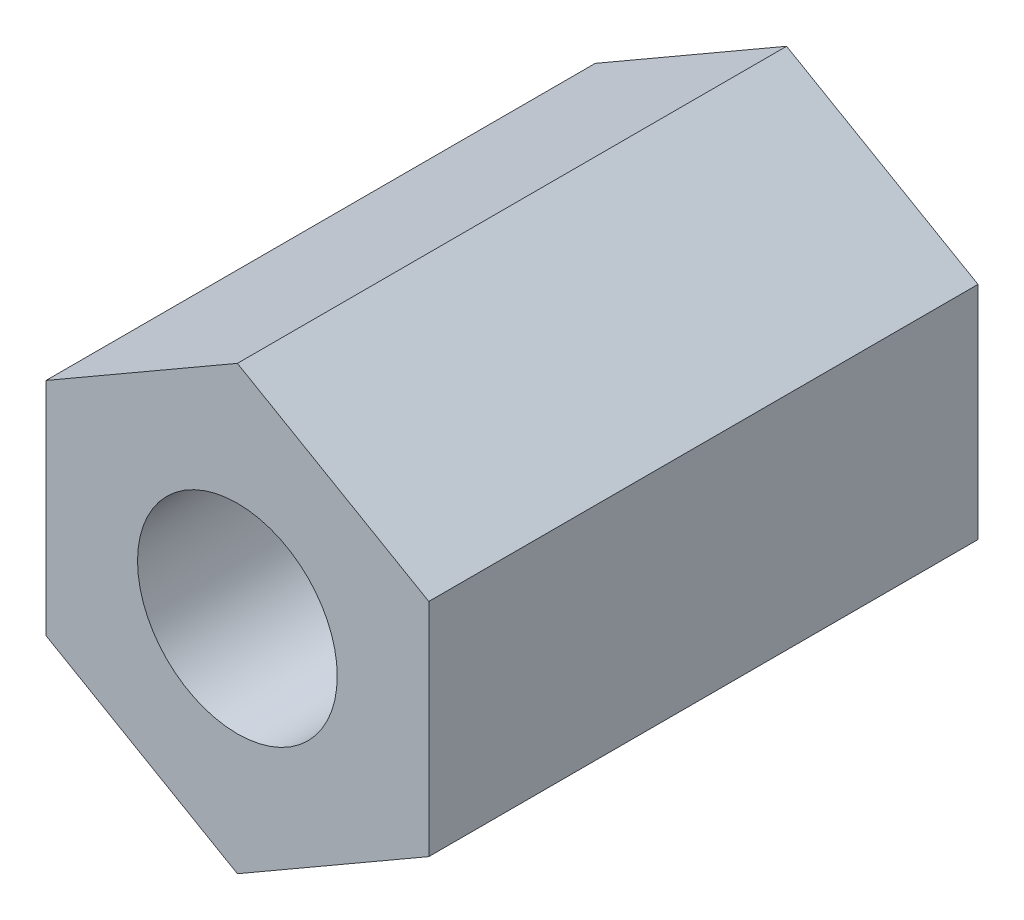
ISO-10303-21;
HEADER;
FILE_DESCRIPTION(('STEP AP214'),'2;1');
FILE_NAME('part.step','',(''),(''),'','','');
FILE_SCHEMA(('AUTOMOTIVE_DESIGN { 1 0 10303 214 1 1 1 1 }'));
ENDSEC;
DATA;
#1=APPLICATION_CONTEXT('core data for automotive mechanical design processes');
#2=APPLICATION_PROTOCOL_DEFINITION('international standard','automotive_design',2000,#1);
#3=PRODUCT_CONTEXT('',#1,'mechanical');
#4=PRODUCT('Part','Part','',(#3));
#5=PRODUCT_RELATED_PRODUCT_CATEGORY('part','',(#4));
#6=PRODUCT_DEFINITION_FORMATION('','',#4);
#7=PRODUCT_DEFINITION_CONTEXT('part definition',#1,'design');
#8=PRODUCT_DEFINITION('design','',#6,#7);
#9=PRODUCT_DEFINITION_SHAPE('','',#8);
#10=(LENGTH_UNIT() NAMED_UNIT(*) SI_UNIT(.MILLI.,.METRE.));
#11=(NAMED_UNIT(*) PLANE_ANGLE_UNIT() SI_UNIT($,.RADIAN.));
#12=(NAMED_UNIT(*) SI_UNIT($,.STERADIAN.) SOLID_ANGLE_UNIT());
#13=UNCERTAINTY_MEASURE_WITH_UNIT(LENGTH_MEASURE(1.E-05),#10,'distance_accuracy_value','');
#14=(GEOMETRIC_REPRESENTATION_CONTEXT(3) GLOBAL_UNCERTAINTY_ASSIGNED_CONTEXT((#13)) GLOBAL_UNIT_ASSIGNED_CONTEXT((#10,
#11,#12)) REPRESENTATION_CONTEXT('',''));
#15=CARTESIAN_POINT('',(0.,0.,0.));
#16=DIRECTION('',(0.,0.,1.));
#17=DIRECTION('',(1.,0.,0.));
#18=AXIS2_PLACEMENT_3D('',#15,#16,#17);
#19=CARTESIAN_POINT('',(23.,13.2790561913614,66.));
#20=DIRECTION('',(-0.5,-0.866025403784439,0.));
#21=DIRECTION('',(0.866025403784439,-0.5,0.));
#22=AXIS2_PLACEMENT_3D('',#19,#20,#21);
#23=PLANE('',#22);
#24=DIRECTION('',(-0.866025403784438,0.5,0.));
#25=VECTOR('',#24,1.);
#26=CARTESIAN_POINT('',(23.,13.2790561913614,0.));
#27=LINE('',#26,#25);
#28=CARTESIAN_POINT('',(23.,13.2790561913614,0.));
#29=VERTEX_POINT('',#28);
#30=CARTESIAN_POINT('',(0.,26.5581123827228,0.));
#31=VERTEX_POINT('',#30);
#32=EDGE_CURVE('E117',#29,#31,#27,.T.);
#33=ORIENTED_EDGE('',*,*,#32,.T.);
#34=DIRECTION('',(0.,0.,-1.));
#35=VECTOR('',#34,1.);
#36=CARTESIAN_POINT('',(0.,26.5581123827228,66.));
#37=LINE('',#36,#35);
#38=CARTESIAN_POINT('',(0.,26.5581123827228,66.));
#39=VERTEX_POINT('',#38);
#40=EDGE_CURVE('E11',#39,#31,#37,.T.);
#41=ORIENTED_EDGE('',*,*,#40,.F.);
#42=DIRECTION('',(-0.866025403784438,0.5,0.));
#43=VECTOR('',#42,1.);
#44=CARTESIAN_POINT('',(23.,13.2790561913614,66.));
#45=LINE('',#44,#43);
#46=CARTESIAN_POINT('',(23.,13.2790561913614,66.));
#47=VERTEX_POINT('',#46);
#48=EDGE_CURVE('E128',#47,#39,#45,.T.);
#49=ORIENTED_EDGE('',*,*,#48,.F.);
#50=DIRECTION('',(0.,0.,-1.));
#51=VECTOR('',#50,1.);
#52=CARTESIAN_POINT('',(23.,13.2790561913614,66.));
#53=LINE('',#52,#51);
#54=EDGE_CURVE('E113',#47,#29,#53,.T.);
#55=ORIENTED_EDGE('',*,*,#54,.T.);
#56=EDGE_LOOP('',(#33,#41,#49,#55));
#57=FACE_BOUND('',#56,.T.);
#58=ADVANCED_FACE('F32',(#57),#23,.F.);
#59=CARTESIAN_POINT('',(0.,26.5581123827228,66.));
#60=DIRECTION('',(0.5,-0.866025403784439,0.));
#61=DIRECTION('',(0.866025403784439,0.5,0.));
#62=AXIS2_PLACEMENT_3D('',#59,#60,#61);
#63=PLANE('',#62);
#64=DIRECTION('',(-0.866025403784439,-0.5,0.));
#65=VECTOR('',#64,1.);
#66=CARTESIAN_POINT('',(0.,26.5581123827228,0.));
#67=LINE('',#66,#65);
#68=CARTESIAN_POINT('',(-23.,13.2790561913614,0.));
#69=VERTEX_POINT('',#68);
#70=EDGE_CURVE('E120',#31,#69,#67,.T.);
#71=ORIENTED_EDGE('',*,*,#70,.T.);
#72=DIRECTION('',(0.,0.,-1.));
#73=VECTOR('',#72,1.);
#74=CARTESIAN_POINT('',(-23.,13.2790561913614,66.));
#75=LINE('',#74,#73);
#76=CARTESIAN_POINT('',(-23.,13.2790561913614,66.));
#77=VERTEX_POINT('',#76);
#78=EDGE_CURVE('E41',#77,#69,#75,.T.);
#79=ORIENTED_EDGE('',*,*,#78,.F.);
#80=DIRECTION('',(-0.866025403784439,-0.5,0.));
#81=VECTOR('',#80,1.);
#82=CARTESIAN_POINT('',(0.,26.5581123827228,66.));
#83=LINE('',#82,#81);
#84=EDGE_CURVE('E86',#39,#77,#83,.T.);
#85=ORIENTED_EDGE('',*,*,#84,.F.);
#86=ORIENTED_EDGE('',*,*,#40,.T.);
#87=EDGE_LOOP('',(#71,#79,#85,#86));
#88=FACE_BOUND('',#87,.T.);
#89=ADVANCED_FACE('F154',(#88),#63,.F.);
#90=CARTESIAN_POINT('',(-23.,13.2790561913614,66.));
#91=DIRECTION('',(1.,0.,0.));
#92=DIRECTION('',(0.,0.,-1.));
#93=AXIS2_PLACEMENT_3D('',#90,#91,#92);
#94=PLANE('',#93);
#95=DIRECTION('',(0.,-1.,0.));
#96=VECTOR('',#95,1.);
#97=CARTESIAN_POINT('',(-23.,13.2790561913614,0.));
#98=LINE('',#97,#96);
#99=CARTESIAN_POINT('',(-23.,-13.2790561913614,0.));
#100=VERTEX_POINT('',#99);
#101=EDGE_CURVE('E123',#69,#100,#98,.T.);
#102=ORIENTED_EDGE('',*,*,#101,.T.);
#103=DIRECTION('',(0.,0.,-1.));
#104=VECTOR('',#103,1.);
#105=CARTESIAN_POINT('',(-23.,-13.2790561913614,66.));
#106=LINE('',#105,#104);
#107=CARTESIAN_POINT('',(-23.,-13.2790561913614,66.));
#108=VERTEX_POINT('',#107);
#109=EDGE_CURVE('E108',#108,#100,#106,.T.);
#110=ORIENTED_EDGE('',*,*,#109,.F.);
#111=DIRECTION('',(0.,-1.,0.));
#112=VECTOR('',#111,1.);
#113=CARTESIAN_POINT('',(-23.,13.2790561913614,66.));
#114=LINE('',#113,#112);
#115=EDGE_CURVE('E99',#77,#108,#114,.T.);
#116=ORIENTED_EDGE('',*,*,#115,.F.);
#117=ORIENTED_EDGE('',*,*,#78,.T.);
#118=EDGE_LOOP('',(#102,#110,#116,#117));
#119=FACE_BOUND('',#118,.T.);
#120=ADVANCED_FACE('F135',(#119),#94,.F.);
#121=CARTESIAN_POINT('',(-23.,-13.2790561913614,66.));
#122=DIRECTION('',(0.5,0.866025403784439,0.));
#123=DIRECTION('',(-0.866025403784439,0.5,0.));
#124=AXIS2_PLACEMENT_3D('',#121,#122,#123);
#125=PLANE('',#124);
#126=DIRECTION('',(0.866025403784438,-0.5,0.));
#127=VECTOR('',#126,1.);
#128=CARTESIAN_POINT('',(-23.,-13.2790561913614,0.));
#129=LINE('',#128,#127);
#130=CARTESIAN_POINT('',(0.,-26.5581123827228,0.));
#131=VERTEX_POINT('',#130);
#132=EDGE_CURVE('E107',#100,#131,#129,.T.);
#133=ORIENTED_EDGE('',*,*,#132,.T.);
#134=DIRECTION('',(0.,0.,-1.));
#135=VECTOR('',#134,1.);
#136=CARTESIAN_POINT('',(0.,-26.5581123827228,66.));
#137=LINE('',#136,#135);
#138=CARTESIAN_POINT('',(0.,-26.5581123827228,66.));
#139=VERTEX_POINT('',#138);
#140=EDGE_CURVE('E104',#139,#131,#137,.T.);
#141=ORIENTED_EDGE('',*,*,#140,.F.);
#142=DIRECTION('',(0.866025403784438,-0.5,0.));
#143=VECTOR('',#142,1.);
#144=CARTESIAN_POINT('',(-23.,-13.2790561913614,66.));
#145=LINE('',#144,#143);
#146=EDGE_CURVE('E93',#108,#139,#145,.T.);
#147=ORIENTED_EDGE('',*,*,#146,.F.);
#148=ORIENTED_EDGE('',*,*,#109,.T.);
#149=EDGE_LOOP('',(#133,#141,#147,#148));
#150=FACE_BOUND('',#149,.T.);
#151=ADVANCED_FACE('F105',(#150),#125,.F.);
#152=CARTESIAN_POINT('',(0.,-26.5581123827228,66.));
#153=DIRECTION('',(-0.5,0.866025403784439,0.));
#154=DIRECTION('',(-0.866025403784439,-0.5,0.));
#155=AXIS2_PLACEMENT_3D('',#152,#153,#154);
#156=PLANE('',#155);
#157=DIRECTION('',(0.866025403784439,0.5,0.));
#158=VECTOR('',#157,1.);
#159=CARTESIAN_POINT('',(0.,-26.5581123827228,0.));
#160=LINE('',#159,#158);
#161=CARTESIAN_POINT('',(23.,-13.2790561913614,0.));
#162=VERTEX_POINT('',#161);
#163=EDGE_CURVE('E72',#131,#162,#160,.T.);
#164=ORIENTED_EDGE('',*,*,#163,.T.);
#165=DIRECTION('',(0.,0.,-1.));
#166=VECTOR('',#165,1.);
#167=CARTESIAN_POINT('',(23.,-13.2790561913614,66.));
#168=LINE('',#167,#166);
#169=CARTESIAN_POINT('',(23.,-13.2790561913614,66.));
#170=VERTEX_POINT('',#169);
#171=EDGE_CURVE('E109',#170,#162,#168,.T.);
#172=ORIENTED_EDGE('',*,*,#171,.F.);
#173=DIRECTION('',(0.866025403784439,0.5,0.));
#174=VECTOR('',#173,1.);
#175=CARTESIAN_POINT('',(0.,-26.5581123827228,66.));
#176=LINE('',#175,#174);
#177=EDGE_CURVE('E97',#139,#170,#176,.T.);
#178=ORIENTED_EDGE('',*,*,#177,.F.);
#179=ORIENTED_EDGE('',*,*,#140,.T.);
#180=EDGE_LOOP('',(#164,#172,#178,#179));
#181=FACE_BOUND('',#180,.T.);
#182=ADVANCED_FACE('F111',(#181),#156,.F.);
#183=CARTESIAN_POINT('',(23.,-13.2790561913614,66.));
#184=DIRECTION('',(-1.,0.,0.));
#185=DIRECTION('',(0.,0.,1.));
#186=AXIS2_PLACEMENT_3D('',#183,#184,#185);
#187=PLANE('',#186);
#188=DIRECTION('',(0.,1.,0.));
#189=VECTOR('',#188,1.);
#190=CARTESIAN_POINT('',(23.,-13.2790561913614,0.));
#191=LINE('',#190,#189);
#192=EDGE_CURVE('E78',#162,#29,#191,.T.);
#193=ORIENTED_EDGE('',*,*,#192,.T.);
#194=ORIENTED_EDGE('',*,*,#54,.F.);
#195=DIRECTION('',(0.,1.,0.));
#196=VECTOR('',#195,1.);
#197=CARTESIAN_POINT('',(23.,-13.2790561913614,66.));
#198=LINE('',#197,#196);
#199=EDGE_CURVE('E49',#170,#47,#198,.T.);
#200=ORIENTED_EDGE('',*,*,#199,.F.);
#201=ORIENTED_EDGE('',*,*,#171,.T.);
#202=EDGE_LOOP('',(#193,#194,#200,#201));
#203=FACE_BOUND('',#202,.T.);
#204=ADVANCED_FACE('F142',(#203),#187,.F.);
#205=CARTESIAN_POINT('',(0.,26.5581123827228,66.));
#206=DIRECTION('',(0.,0.,1.));
#207=DIRECTION('',(1.,0.,0.));
#208=AXIS2_PLACEMENT_3D('',#205,#206,#207);
#209=PLANE('',#208);
#210=CARTESIAN_POINT('',(0.,0.,66.));
#211=DIRECTION('',(0.,0.,1.));
#212=DIRECTION('',(1.,0.,0.));
#213=AXIS2_PLACEMENT_3D('',#210,#211,#212);
#214=CIRCLE('',#213,12.);
#215=CARTESIAN_POINT('',(12.,0.,66.));
#216=VERTEX_POINT('',#215);
#217=EDGE_CURVE('E237',#216,#216,#214,.T.);
#218=ORIENTED_EDGE('',*,*,#217,.F.);
#219=EDGE_LOOP('',(#218));
#220=FACE_BOUND('',#219,.T.);
#221=ORIENTED_EDGE('',*,*,#48,.T.);
#222=ORIENTED_EDGE('',*,*,#84,.T.);
#223=ORIENTED_EDGE('',*,*,#115,.T.);
#224=ORIENTED_EDGE('',*,*,#146,.T.);
#225=ORIENTED_EDGE('',*,*,#177,.T.);
#226=ORIENTED_EDGE('',*,*,#199,.T.);
#227=EDGE_LOOP('',(#221,#222,#223,#224,#225,#226));
#228=FACE_BOUND('',#227,.T.);
#229=ADVANCED_FACE('F95',(#220,#228),#209,.T.);
#230=CARTESIAN_POINT('',(0.,26.5581123827228,0.));
#231=DIRECTION('',(0.,0.,1.));
#232=DIRECTION('',(1.,0.,0.));
#233=AXIS2_PLACEMENT_3D('',#230,#231,#232);
#234=PLANE('',#233);
#235=CARTESIAN_POINT('',(0.,0.,0.));
#236=DIRECTION('',(0.,0.,-1.));
#237=DIRECTION('',(-1.,0.,0.));
#238=AXIS2_PLACEMENT_3D('',#235,#236,#237);
#239=CIRCLE('',#238,15.);
#240=CARTESIAN_POINT('',(-15.,0.,0.));
#241=VERTEX_POINT('',#240);
#242=EDGE_CURVE('E121',#241,#241,#239,.T.);
#243=ORIENTED_EDGE('',*,*,#242,.F.);
#244=EDGE_LOOP('',(#243));
#245=FACE_BOUND('',#244,.T.);
#246=ORIENTED_EDGE('',*,*,#32,.F.);
#247=ORIENTED_EDGE('',*,*,#192,.F.);
#248=ORIENTED_EDGE('',*,*,#163,.F.);
#249=ORIENTED_EDGE('',*,*,#132,.F.);
#250=ORIENTED_EDGE('',*,*,#101,.F.);
#251=ORIENTED_EDGE('',*,*,#70,.F.);
#252=EDGE_LOOP('',(#246,#247,#248,#249,#250,#251));
#253=FACE_BOUND('',#252,.T.);
#254=ADVANCED_FACE('F138',(#245,#253),#234,.F.);
#255=CARTESIAN_POINT('',(0.,0.,40.));
#256=DIRECTION('',(0.,0.,-1.));
#257=DIRECTION('',(-1.,0.,0.));
#258=AXIS2_PLACEMENT_3D('',#255,#256,#257);
#259=CYLINDRICAL_SURFACE('',#258,15.);
#260=CARTESIAN_POINT('',(0.,0.,40.));
#261=DIRECTION('',(0.,0.,-1.));
#262=DIRECTION('',(-1.,0.,0.));
#263=AXIS2_PLACEMENT_3D('',#260,#261,#262);
#264=CIRCLE('',#263,15.);
#265=CARTESIAN_POINT('',(-15.,0.,40.));
#266=VERTEX_POINT('',#265);
#267=EDGE_CURVE('E242',#266,#266,#264,.T.);
#268=ORIENTED_EDGE('',*,*,#267,.F.);
#269=EDGE_LOOP('',(#268));
#270=FACE_BOUND('',#269,.T.);
#271=ORIENTED_EDGE('',*,*,#242,.T.);
#272=EDGE_LOOP('',(#271));
#273=FACE_BOUND('',#272,.T.);
#274=ADVANCED_FACE('F186',(#270,#273),#259,.F.);
#275=CARTESIAN_POINT('',(0.,0.,40.));
#276=DIRECTION('',(0.,0.,-1.));
#277=DIRECTION('',(-1.,0.,0.));
#278=AXIS2_PLACEMENT_3D('',#275,#276,#277);
#279=CONICAL_SURFACE('',#278,15.,0.436332312998583);
#280=CARTESIAN_POINT('',(0.,0.,44.));
#281=DIRECTION('',(0.,0.,-1.));
#282=DIRECTION('',(-1.,0.,0.));
#283=AXIS2_PLACEMENT_3D('',#280,#281,#282);
#284=CIRCLE('',#283,13.13476936738);
#285=CARTESIAN_POINT('',(-13.13476936738,0.,44.));
#286=VERTEX_POINT('',#285);
#287=EDGE_CURVE('E240',#286,#286,#284,.T.);
#288=ORIENTED_EDGE('',*,*,#287,.F.);
#289=EDGE_LOOP('',(#288));
#290=FACE_BOUND('',#289,.T.);
#291=ORIENTED_EDGE('',*,*,#267,.T.);
#292=EDGE_LOOP('',(#291));
#293=FACE_BOUND('',#292,.T.);
#294=ADVANCED_FACE('F195',(#290,#293),#279,.F.);
#295=CARTESIAN_POINT('',(0.,0.,44.));
#296=DIRECTION('',(0.,0.,-1.));
#297=DIRECTION('',(-1.,0.,0.));
#298=AXIS2_PLACEMENT_3D('',#295,#296,#297);
#299=CONICAL_SURFACE('',#298,13.13476936738,0.698131700797733);
#300=CARTESIAN_POINT('',(0.,0.,45.352365470341));
#301=DIRECTION('',(0.,0.,-1.));
#302=DIRECTION('',(-1.,0.,0.));
#303=AXIS2_PLACEMENT_3D('',#300,#301,#302);
#304=CIRCLE('',#303,12.);
#305=CARTESIAN_POINT('',(-12.,0.,45.352365470341));
#306=VERTEX_POINT('',#305);
#307=EDGE_CURVE('E35',#306,#306,#304,.F.);
#308=ORIENTED_EDGE('',*,*,#307,.T.);
#309=EDGE_LOOP('',(#308));
#310=FACE_BOUND('',#309,.T.);
#311=ORIENTED_EDGE('',*,*,#287,.T.);
#312=EDGE_LOOP('',(#311));
#313=FACE_BOUND('',#312,.T.);
#314=ADVANCED_FACE('F205',(#310,#313),#299,.F.);
#315=CARTESIAN_POINT('',(0.,0.,44.));
#316=DIRECTION('',(0.,0.,1.));
#317=DIRECTION('',(1.,0.,0.));
#318=AXIS2_PLACEMENT_3D('',#315,#316,#317);
#319=CYLINDRICAL_SURFACE('',#318,12.);
#320=ORIENTED_EDGE('',*,*,#217,.T.);
#321=EDGE_LOOP('',(#320));
#322=FACE_BOUND('',#321,.T.);
#323=ORIENTED_EDGE('',*,*,#307,.F.);
#324=EDGE_LOOP('',(#323));
#325=FACE_BOUND('',#324,.T.);
#326=ADVANCED_FACE('F220',(#322,#325),#319,.F.);
#327=CLOSED_SHELL('',(#58,#89,#120,#151,#182,#204,#229,#254,#274,#294,#314,#326));
#328=MANIFOLD_SOLID_BREP('B2',#327);
#329=ADVANCED_BREP_SHAPE_REPRESENTATION('',(#18,#328),#14);
#330=SHAPE_DEFINITION_REPRESENTATION(#9,#329);
ENDSEC;
END-ISO-10303-21;
